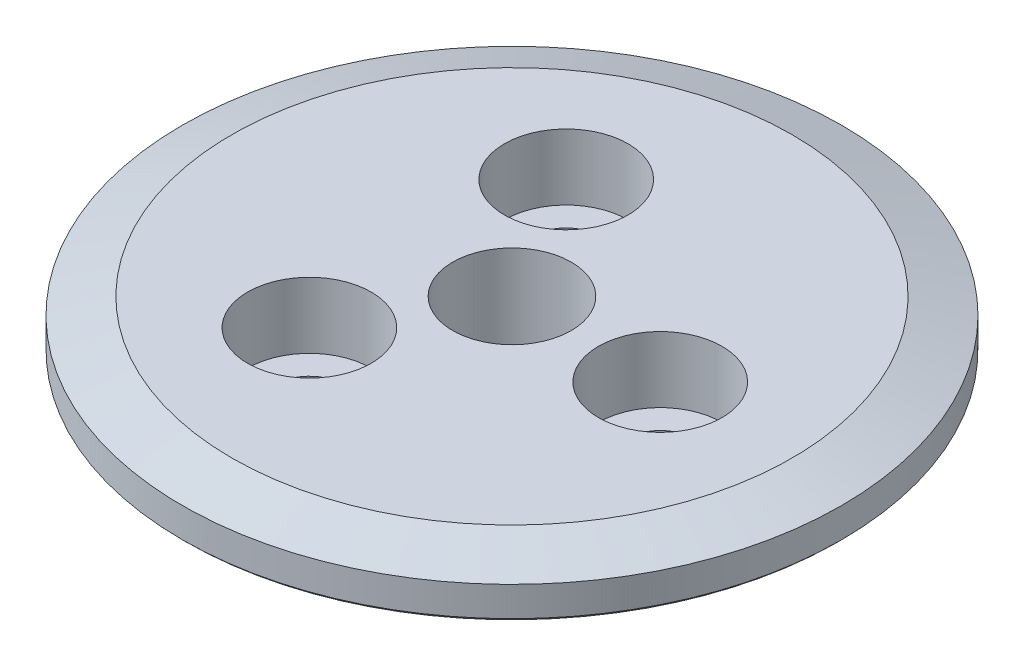
ISO-10303-21;
HEADER;
FILE_DESCRIPTION(('STEP AP214'),'2;1');
FILE_NAME('part.step','',(''),(''),'','','');
FILE_SCHEMA(('AUTOMOTIVE_DESIGN { 1 0 10303 214 1 1 1 1 }'));
ENDSEC;
DATA;
#1=APPLICATION_CONTEXT('core data for automotive mechanical design processes');
#2=APPLICATION_PROTOCOL_DEFINITION('international standard','automotive_design',2000,#1);
#3=PRODUCT_CONTEXT('',#1,'mechanical');
#4=PRODUCT('Part','Part','',(#3));
#5=PRODUCT_RELATED_PRODUCT_CATEGORY('part','',(#4));
#6=PRODUCT_DEFINITION_FORMATION('','',#4);
#7=PRODUCT_DEFINITION_CONTEXT('part definition',#1,'design');
#8=PRODUCT_DEFINITION('design','',#6,#7);
#9=PRODUCT_DEFINITION_SHAPE('','',#8);
#10=(LENGTH_UNIT() NAMED_UNIT(*) SI_UNIT(.MILLI.,.METRE.));
#11=(NAMED_UNIT(*) PLANE_ANGLE_UNIT() SI_UNIT($,.RADIAN.));
#12=(NAMED_UNIT(*) SI_UNIT($,.STERADIAN.) SOLID_ANGLE_UNIT());
#13=UNCERTAINTY_MEASURE_WITH_UNIT(LENGTH_MEASURE(1.E-05),#10,'distance_accuracy_value','');
#14=(GEOMETRIC_REPRESENTATION_CONTEXT(3) GLOBAL_UNCERTAINTY_ASSIGNED_CONTEXT((#13)) GLOBAL_UNIT_ASSIGNED_CONTEXT((#10,
#11,#12)) REPRESENTATION_CONTEXT('',''));
#15=CARTESIAN_POINT('',(0.,0.,0.));
#16=DIRECTION('',(0.,0.,1.));
#17=DIRECTION('',(1.,0.,0.));
#18=AXIS2_PLACEMENT_3D('',#15,#16,#17);
#19=CARTESIAN_POINT('',(0.,-4.6,0.));
#20=DIRECTION('',(0.,-1.,0.));
#21=DIRECTION('',(1.,0.,0.));
#22=AXIS2_PLACEMENT_3D('',#19,#20,#21);
#23=CYLINDRICAL_SURFACE('',#22,14.75);
#24=CARTESIAN_POINT('',(0.,-3.19999999999999,0.));
#25=DIRECTION('',(0.,-1.,0.));
#26=DIRECTION('',(0.,0.,-1.));
#27=AXIS2_PLACEMENT_3D('',#24,#25,#26);
#28=CIRCLE('',#27,14.75);
#29=CARTESIAN_POINT('',(0.,-3.19999999999999,-14.75));
#30=VERTEX_POINT('',#29);
#31=EDGE_CURVE('E168',#30,#30,#28,.T.);
#32=ORIENTED_EDGE('',*,*,#31,.T.);
#33=EDGE_LOOP('',(#32));
#34=FACE_BOUND('',#33,.T.);
#35=CARTESIAN_POINT('',(0.,-5.99999999991025,0.));
#36=DIRECTION('',(0.,1.,0.));
#37=DIRECTION('',(-1.,0.,0.));
#38=AXIS2_PLACEMENT_3D('',#35,#36,#37);
#39=CIRCLE('',#38,14.7499999999103);
#40=CARTESIAN_POINT('',(-14.7499999999103,-5.99999999991025,0.));
#41=VERTEX_POINT('',#40);
#42=EDGE_CURVE('E123',#41,#41,#39,.F.);
#43=ORIENTED_EDGE('',*,*,#42,.F.);
#44=EDGE_LOOP('',(#43));
#45=FACE_BOUND('',#44,.T.);
#46=ADVANCED_FACE('F15',(#34,#45),#23,.T.);
#47=CARTESIAN_POINT('',(0.,-3.19999999999999,0.));
#48=DIRECTION('',(0.,-1.,0.));
#49=DIRECTION('',(0.,0.,-1.));
#50=AXIS2_PLACEMENT_3D('',#47,#48,#49);
#51=TOROIDAL_SURFACE('',#50,14.95,0.2);
#52=ORIENTED_EDGE('',*,*,#31,.F.);
#53=EDGE_LOOP('',(#52));
#54=FACE_BOUND('',#53,.T.);
#55=CARTESIAN_POINT('',(0.,-2.99999999999999,0.));
#56=DIRECTION('',(0.,-1.,0.));
#57=DIRECTION('',(1.,0.,0.));
#58=AXIS2_PLACEMENT_3D('',#55,#56,#57);
#59=CIRCLE('',#58,14.95);
#60=CARTESIAN_POINT('',(14.95,-2.99999999999999,0.));
#61=VERTEX_POINT('',#60);
#62=EDGE_CURVE('E117',#61,#61,#59,.F.);
#63=ORIENTED_EDGE('',*,*,#62,.F.);
#64=EDGE_LOOP('',(#63));
#65=FACE_BOUND('',#64,.T.);
#66=ADVANCED_FACE('F174',(#54,#65),#51,.F.);
#67=CARTESIAN_POINT('',(0.,-5.99999999991025,0.));
#68=DIRECTION('',(0.,1.,0.));
#69=DIRECTION('',(0.,0.,1.));
#70=AXIS2_PLACEMENT_3D('',#67,#68,#69);
#71=CONICAL_SURFACE('',#70,14.7499999999103,0.785398162499996);
#72=CARTESIAN_POINT('',(0.,-6.20000000008974,0.));
#73=DIRECTION('',(0.,1.,0.));
#74=DIRECTION('',(0.,0.,1.));
#75=AXIS2_PLACEMENT_3D('',#72,#73,#74);
#76=CIRCLE('',#75,14.5500000000897);
#77=CARTESIAN_POINT('',(0.,-6.20000000008974,14.5500000000897));
#78=VERTEX_POINT('',#77);
#79=EDGE_CURVE('E18',#78,#78,#76,.F.);
#80=ORIENTED_EDGE('',*,*,#79,.F.);
#81=EDGE_LOOP('',(#80));
#82=FACE_BOUND('',#81,.T.);
#83=ORIENTED_EDGE('',*,*,#42,.T.);
#84=EDGE_LOOP('',(#83));
#85=FACE_BOUND('',#84,.T.);
#86=ADVANCED_FACE('F155',(#82,#85),#71,.T.);
#87=CARTESIAN_POINT('',(0.,-6.4,0.));
#88=DIRECTION('',(0.,-1.,0.));
#89=DIRECTION('',(0.,0.,-1.));
#90=AXIS2_PLACEMENT_3D('',#87,#88,#89);
#91=TOROIDAL_SURFACE('',#90,5.2,0.2);
#92=CARTESIAN_POINT('',(0.,-6.4,0.));
#93=DIRECTION('',(0.,-1.,0.));
#94=DIRECTION('',(1.,0.,0.));
#95=AXIS2_PLACEMENT_3D('',#92,#93,#94);
#96=CIRCLE('',#95,5.);
#97=CARTESIAN_POINT('',(5.,-6.4,0.));
#98=VERTEX_POINT('',#97);
#99=EDGE_CURVE('E112',#98,#98,#96,.T.);
#100=ORIENTED_EDGE('',*,*,#99,.F.);
#101=EDGE_LOOP('',(#100));
#102=FACE_BOUND('',#101,.T.);
#103=CARTESIAN_POINT('',(0.,-6.2,0.));
#104=DIRECTION('',(0.,-1.,0.));
#105=DIRECTION('',(1.,0.,0.));
#106=AXIS2_PLACEMENT_3D('',#103,#104,#105);
#107=CIRCLE('',#106,5.2);
#108=CARTESIAN_POINT('',(5.2,-6.2,0.));
#109=VERTEX_POINT('',#108);
#110=EDGE_CURVE('E97',#109,#109,#107,.F.);
#111=ORIENTED_EDGE('',*,*,#110,.F.);
#112=EDGE_LOOP('',(#111));
#113=FACE_BOUND('',#112,.T.);
#114=ADVANCED_FACE('F151',(#102,#113),#91,.F.);
#115=CARTESIAN_POINT('',(17.375,-3.,0.));
#116=DIRECTION('',(0.,-1.,0.));
#117=DIRECTION('',(0.,0.,-1.));
#118=AXIS2_PLACEMENT_3D('',#115,#116,#117);
#119=PLANE('',#118);
#120=ORIENTED_EDGE('',*,*,#62,.T.);
#121=EDGE_LOOP('',(#120));
#122=FACE_BOUND('',#121,.T.);
#123=CARTESIAN_POINT('',(0.,-3.00000000008974,0.));
#124=DIRECTION('',(0.,1.,0.));
#125=DIRECTION('',(0.,0.,1.));
#126=AXIS2_PLACEMENT_3D('',#123,#124,#125);
#127=CIRCLE('',#126,19.8000000000897);
#128=CARTESIAN_POINT('',(0.,-3.00000000008974,19.8000000000897));
#129=VERTEX_POINT('',#128);
#130=EDGE_CURVE('E94',#129,#129,#127,.T.);
#131=ORIENTED_EDGE('',*,*,#130,.F.);
#132=EDGE_LOOP('',(#131));
#133=FACE_BOUND('',#132,.T.);
#134=ADVANCED_FACE('F140',(#122,#133),#119,.T.);
#135=CARTESIAN_POINT('',(0.,-7.7,0.));
#136=DIRECTION('',(0.,-1.,0.));
#137=DIRECTION('',(1.,0.,0.));
#138=AXIS2_PLACEMENT_3D('',#135,#136,#137);
#139=CYLINDRICAL_SURFACE('',#138,5.);
#140=ORIENTED_EDGE('',*,*,#99,.T.);
#141=EDGE_LOOP('',(#140));
#142=FACE_BOUND('',#141,.T.);
#143=CARTESIAN_POINT('',(0.,-8.99999999990087,0.));
#144=DIRECTION('',(0.,1.,0.));
#145=DIRECTION('',(-1.,0.,0.));
#146=AXIS2_PLACEMENT_3D('',#143,#144,#145);
#147=CIRCLE('',#146,4.99999999988177);
#148=CARTESIAN_POINT('',(-4.99999999988177,-8.99999999990087,0.));
#149=VERTEX_POINT('',#148);
#150=EDGE_CURVE('E93',#149,#149,#147,.F.);
#151=ORIENTED_EDGE('',*,*,#150,.F.);
#152=EDGE_LOOP('',(#151));
#153=FACE_BOUND('',#152,.T.);
#154=ADVANCED_FACE('F150',(#142,#153),#139,.T.);
#155=CARTESIAN_POINT('',(9.875,-6.2,0.));
#156=DIRECTION('',(0.,-1.,0.));
#157=DIRECTION('',(0.,0.,-1.));
#158=AXIS2_PLACEMENT_3D('',#155,#156,#157);
#159=PLANE('',#158);
#160=ORIENTED_EDGE('',*,*,#110,.T.);
#161=EDGE_LOOP('',(#160));
#162=FACE_BOUND('',#161,.T.);
#163=CARTESIAN_POINT('',(9.,-6.19999999999999,0.));
#164=DIRECTION('',(0.,1.,0.));
#165=DIRECTION('',(-1.,0.,0.));
#166=AXIS2_PLACEMENT_3D('',#163,#164,#165);
#167=CIRCLE('',#166,2.05);
#168=CARTESIAN_POINT('',(6.95,-6.19999999999999,0.));
#169=VERTEX_POINT('',#168);
#170=EDGE_CURVE('E90',#169,#169,#167,.T.);
#171=ORIENTED_EDGE('',*,*,#170,.T.);
#172=EDGE_LOOP('',(#171));
#173=FACE_BOUND('',#172,.T.);
#174=CARTESIAN_POINT('',(-4.5,-6.19999999999999,7.79422863405995));
#175=DIRECTION('',(0.,1.,0.));
#176=DIRECTION('',(-1.,0.,0.));
#177=AXIS2_PLACEMENT_3D('',#174,#175,#176);
#178=CIRCLE('',#177,2.05);
#179=CARTESIAN_POINT('',(-6.55,-6.19999999999999,7.79422863405995));
#180=VERTEX_POINT('',#179);
#181=EDGE_CURVE('E86',#180,#180,#178,.T.);
#182=ORIENTED_EDGE('',*,*,#181,.T.);
#183=EDGE_LOOP('',(#182));
#184=FACE_BOUND('',#183,.T.);
#185=CARTESIAN_POINT('',(-4.50000000000001,-6.19999999999999,-7.79422863405995));
#186=DIRECTION('',(0.,1.,0.));
#187=DIRECTION('',(-1.,0.,0.));
#188=AXIS2_PLACEMENT_3D('',#185,#186,#187);
#189=CIRCLE('',#188,2.05);
#190=CARTESIAN_POINT('',(-6.55000000000001,-6.19999999999999,-7.79422863405995));
#191=VERTEX_POINT('',#190);
#192=EDGE_CURVE('E82',#191,#191,#189,.T.);
#193=ORIENTED_EDGE('',*,*,#192,.T.);
#194=EDGE_LOOP('',(#193));
#195=FACE_BOUND('',#194,.T.);
#196=ORIENTED_EDGE('',*,*,#79,.T.);
#197=EDGE_LOOP('',(#196));
#198=FACE_BOUND('',#197,.T.);
#199=ADVANCED_FACE('F253',(#162,#173,#184,#195,#198),#159,.T.);
#200=CARTESIAN_POINT('',(0.,-2.79999999991025,0.));
#201=DIRECTION('',(0.,1.,0.));
#202=DIRECTION('',(0.,0.,1.));
#203=AXIS2_PLACEMENT_3D('',#200,#201,#202);
#204=CONICAL_SURFACE('',#203,19.9999999999103,0.7853981625);
#205=ORIENTED_EDGE('',*,*,#130,.T.);
#206=EDGE_LOOP('',(#205));
#207=FACE_BOUND('',#206,.T.);
#208=CARTESIAN_POINT('',(0.,-2.79999999999999,0.));
#209=DIRECTION('',(0.,-1.,0.));
#210=DIRECTION('',(1.,0.,0.));
#211=AXIS2_PLACEMENT_3D('',#208,#209,#210);
#212=CIRCLE('',#211,20.);
#213=CARTESIAN_POINT('',(20.,-2.79999999999999,0.));
#214=VERTEX_POINT('',#213);
#215=EDGE_CURVE('E81',#214,#214,#212,.F.);
#216=ORIENTED_EDGE('',*,*,#215,.F.);
#217=EDGE_LOOP('',(#216));
#218=FACE_BOUND('',#217,.T.);
#219=ADVANCED_FACE('F250',(#207,#218),#204,.T.);
#220=CARTESIAN_POINT('',(0.,-9.00000000001455,0.));
#221=DIRECTION('',(0.,1.,0.));
#222=DIRECTION('',(0.,0.,1.));
#223=AXIS2_PLACEMENT_3D('',#220,#221,#222);
#224=CONICAL_SURFACE('',#223,4.99999999982492,0.785398162686906);
#225=CARTESIAN_POINT('',(0.,-9.20000000002119,0.));
#226=DIRECTION('',(0.,1.,0.));
#227=DIRECTION('',(0.,0.,1.));
#228=AXIS2_PLACEMENT_3D('',#225,#226,#227);
#229=CIRCLE('',#228,4.8000000001025);
#230=CARTESIAN_POINT('',(0.,-9.20000000002119,4.8000000001025));
#231=VERTEX_POINT('',#230);
#232=EDGE_CURVE('E77',#231,#231,#229,.F.);
#233=ORIENTED_EDGE('',*,*,#232,.F.);
#234=EDGE_LOOP('',(#233));
#235=FACE_BOUND('',#234,.T.);
#236=ORIENTED_EDGE('',*,*,#150,.T.);
#237=EDGE_LOOP('',(#236));
#238=FACE_BOUND('',#237,.T.);
#239=ADVANCED_FACE('F246',(#235,#238),#224,.T.);
#240=CARTESIAN_POINT('',(9.,-57.3117788940459,0.));
#241=DIRECTION('',(0.,1.,0.));
#242=DIRECTION('',(-1.,0.,0.));
#243=AXIS2_PLACEMENT_3D('',#240,#241,#242);
#244=CYLINDRICAL_SURFACE('',#243,2.05);
#245=CARTESIAN_POINT('',(9.,-4.,0.));
#246=DIRECTION('',(0.,1.,0.));
#247=DIRECTION('',(-1.,0.,0.));
#248=AXIS2_PLACEMENT_3D('',#245,#246,#247);
#249=CIRCLE('',#248,2.05);
#250=CARTESIAN_POINT('',(6.95,-4.,0.));
#251=VERTEX_POINT('',#250);
#252=EDGE_CURVE('E73',#251,#251,#249,.F.);
#253=ORIENTED_EDGE('',*,*,#252,.F.);
#254=EDGE_LOOP('',(#253));
#255=FACE_BOUND('',#254,.T.);
#256=ORIENTED_EDGE('',*,*,#170,.F.);
#257=EDGE_LOOP('',(#256));
#258=FACE_BOUND('',#257,.T.);
#259=ADVANCED_FACE('F242',(#255,#258),#244,.F.);
#260=CARTESIAN_POINT('',(-4.49999999999999,-57.3117788940459,7.79422863405995));
#261=DIRECTION('',(0.,1.,0.));
#262=DIRECTION('',(-1.,0.,0.));
#263=AXIS2_PLACEMENT_3D('',#260,#261,#262);
#264=CYLINDRICAL_SURFACE('',#263,2.05);
#265=CARTESIAN_POINT('',(-4.5,-4.,7.79422863405995));
#266=DIRECTION('',(0.,1.,0.));
#267=DIRECTION('',(-1.,0.,0.));
#268=AXIS2_PLACEMENT_3D('',#265,#266,#267);
#269=CIRCLE('',#268,2.05);
#270=CARTESIAN_POINT('',(-6.55,-4.,7.79422863405995));
#271=VERTEX_POINT('',#270);
#272=EDGE_CURVE('E69',#271,#271,#269,.F.);
#273=ORIENTED_EDGE('',*,*,#272,.F.);
#274=EDGE_LOOP('',(#273));
#275=FACE_BOUND('',#274,.T.);
#276=ORIENTED_EDGE('',*,*,#181,.F.);
#277=EDGE_LOOP('',(#276));
#278=FACE_BOUND('',#277,.T.);
#279=ADVANCED_FACE('F238',(#275,#278),#264,.F.);
#280=CARTESIAN_POINT('',(-4.5,-57.3117788940459,-7.79422863405995));
#281=DIRECTION('',(0.,1.,0.));
#282=DIRECTION('',(-1.,0.,0.));
#283=AXIS2_PLACEMENT_3D('',#280,#281,#282);
#284=CYLINDRICAL_SURFACE('',#283,2.05);
#285=CARTESIAN_POINT('',(-4.50000000000001,-4.,-7.79422863405995));
#286=DIRECTION('',(0.,1.,0.));
#287=DIRECTION('',(-1.,0.,0.));
#288=AXIS2_PLACEMENT_3D('',#285,#286,#287);
#289=CIRCLE('',#288,2.05);
#290=CARTESIAN_POINT('',(-6.55000000000001,-4.,-7.79422863405995));
#291=VERTEX_POINT('',#290);
#292=EDGE_CURVE('E66',#291,#291,#289,.F.);
#293=ORIENTED_EDGE('',*,*,#292,.F.);
#294=EDGE_LOOP('',(#293));
#295=FACE_BOUND('',#294,.T.);
#296=ORIENTED_EDGE('',*,*,#192,.F.);
#297=EDGE_LOOP('',(#296));
#298=FACE_BOUND('',#297,.T.);
#299=ADVANCED_FACE('F234',(#295,#298),#284,.F.);
#300=CARTESIAN_POINT('',(0.,-1.5,0.));
#301=DIRECTION('',(0.,-1.,0.));
#302=DIRECTION('',(1.,0.,0.));
#303=AXIS2_PLACEMENT_3D('',#300,#301,#302);
#304=CYLINDRICAL_SURFACE('',#303,20.);
#305=ORIENTED_EDGE('',*,*,#215,.T.);
#306=EDGE_LOOP('',(#305));
#307=FACE_BOUND('',#306,.T.);
#308=CARTESIAN_POINT('',(0.,-1.00000000214087,0.));
#309=DIRECTION('',(0.,-1.,0.));
#310=DIRECTION('',(-1.,0.,0.));
#311=AXIS2_PLACEMENT_3D('',#308,#309,#310);
#312=CIRCLE('',#311,19.9999999992864);
#313=CARTESIAN_POINT('',(-19.9999999992864,-1.00000000214087,0.));
#314=VERTEX_POINT('',#313);
#315=EDGE_CURVE('E65',#314,#314,#312,.F.);
#316=ORIENTED_EDGE('',*,*,#315,.F.);
#317=EDGE_LOOP('',(#316));
#318=FACE_BOUND('',#317,.T.);
#319=ADVANCED_FACE('F230',(#307,#318),#304,.T.);
#320=CARTESIAN_POINT('',(2.5,-9.2,0.));
#321=DIRECTION('',(0.,-1.,0.));
#322=DIRECTION('',(0.,0.,-1.));
#323=AXIS2_PLACEMENT_3D('',#320,#321,#322);
#324=PLANE('',#323);
#325=CARTESIAN_POINT('',(-3.450296E-12,-9.2,1.865175E-13));
#326=DIRECTION('',(0.,-1.,0.));
#327=DIRECTION('',(0.,0.,-1.));
#328=AXIS2_PLACEMENT_3D('',#325,#326,#327);
#329=CIRCLE('',#328,3.6);
#330=CARTESIAN_POINT('',(-3.450296E-12,-9.2,-3.59999999999981));
#331=VERTEX_POINT('',#330);
#332=EDGE_CURVE('E61',#331,#331,#329,.F.);
#333=ORIENTED_EDGE('',*,*,#332,.T.);
#334=EDGE_LOOP('',(#333));
#335=FACE_BOUND('',#334,.T.);
#336=ORIENTED_EDGE('',*,*,#232,.T.);
#337=EDGE_LOOP('',(#336));
#338=FACE_BOUND('',#337,.T.);
#339=ADVANCED_FACE('F226',(#335,#338),#324,.T.);
#340=CARTESIAN_POINT('',(9.,-4.,0.));
#341=DIRECTION('',(0.,1.,0.));
#342=DIRECTION('',(0.,0.,1.));
#343=AXIS2_PLACEMENT_3D('',#340,#341,#342);
#344=PLANE('',#343);
#345=ORIENTED_EDGE('',*,*,#252,.T.);
#346=EDGE_LOOP('',(#345));
#347=FACE_BOUND('',#346,.T.);
#348=CARTESIAN_POINT('',(9.,-4.,0.));
#349=DIRECTION('',(0.,1.,0.));
#350=DIRECTION('',(-1.,0.,0.));
#351=AXIS2_PLACEMENT_3D('',#348,#349,#350);
#352=CIRCLE('',#351,3.75);
#353=CARTESIAN_POINT('',(5.25,-4.,0.));
#354=VERTEX_POINT('',#353);
#355=EDGE_CURVE('E57',#354,#354,#352,.T.);
#356=ORIENTED_EDGE('',*,*,#355,.T.);
#357=EDGE_LOOP('',(#356));
#358=FACE_BOUND('',#357,.T.);
#359=ADVANCED_FACE('F222',(#347,#358),#344,.T.);
#360=CARTESIAN_POINT('',(-4.5,-4.,7.79422863405995));
#361=DIRECTION('',(0.,1.,0.));
#362=DIRECTION('',(0.,0.,1.));
#363=AXIS2_PLACEMENT_3D('',#360,#361,#362);
#364=PLANE('',#363);
#365=ORIENTED_EDGE('',*,*,#272,.T.);
#366=EDGE_LOOP('',(#365));
#367=FACE_BOUND('',#366,.T.);
#368=CARTESIAN_POINT('',(-4.5,-4.,7.79422863405995));
#369=DIRECTION('',(0.,1.,0.));
#370=DIRECTION('',(-1.,0.,0.));
#371=AXIS2_PLACEMENT_3D('',#368,#369,#370);
#372=CIRCLE('',#371,3.75);
#373=CARTESIAN_POINT('',(-8.25,-4.,7.79422863405995));
#374=VERTEX_POINT('',#373);
#375=EDGE_CURVE('E53',#374,#374,#372,.T.);
#376=ORIENTED_EDGE('',*,*,#375,.T.);
#377=EDGE_LOOP('',(#376));
#378=FACE_BOUND('',#377,.T.);
#379=ADVANCED_FACE('F218',(#367,#378),#364,.T.);
#380=CARTESIAN_POINT('',(-4.5,-4.,-7.79422863405995));
#381=DIRECTION('',(0.,1.,0.));
#382=DIRECTION('',(0.,0.,1.));
#383=AXIS2_PLACEMENT_3D('',#380,#381,#382);
#384=PLANE('',#383);
#385=ORIENTED_EDGE('',*,*,#292,.T.);
#386=EDGE_LOOP('',(#385));
#387=FACE_BOUND('',#386,.T.);
#388=CARTESIAN_POINT('',(-4.5,-4.,-7.79422863405995));
#389=DIRECTION('',(0.,1.,0.));
#390=DIRECTION('',(-1.,0.,0.));
#391=AXIS2_PLACEMENT_3D('',#388,#389,#390);
#392=CIRCLE('',#391,3.75);
#393=CARTESIAN_POINT('',(-8.25,-4.,-7.79422863405995));
#394=VERTEX_POINT('',#393);
#395=EDGE_CURVE('E49',#394,#394,#392,.T.);
#396=ORIENTED_EDGE('',*,*,#395,.T.);
#397=EDGE_LOOP('',(#396));
#398=FACE_BOUND('',#397,.T.);
#399=ADVANCED_FACE('F214',(#387,#398),#384,.T.);
#400=CARTESIAN_POINT('',(0.,-1.00000000214087,0.));
#401=DIRECTION('',(0.,-1.,0.));
#402=DIRECTION('',(0.,0.,-1.));
#403=AXIS2_PLACEMENT_3D('',#400,#401,#402);
#404=CONICAL_SURFACE('',#403,19.9999999992864,1.24904577097101);
#405=ORIENTED_EDGE('',*,*,#315,.T.);
#406=EDGE_LOOP('',(#405));
#407=FACE_BOUND('',#406,.T.);
#408=CARTESIAN_POINT('',(0.,2.14086560978988E-09,0.));
#409=DIRECTION('',(0.,-1.,0.));
#410=DIRECTION('',(0.,0.,-1.));
#411=AXIS2_PLACEMENT_3D('',#408,#409,#410);
#412=CIRCLE('',#411,17.0000000007136);
#413=CARTESIAN_POINT('',(0.,2.14086560978988E-09,-17.0000000007136));
#414=VERTEX_POINT('',#413);
#415=EDGE_CURVE('E45',#414,#414,#412,.F.);
#416=ORIENTED_EDGE('',*,*,#415,.F.);
#417=EDGE_LOOP('',(#416));
#418=FACE_BOUND('',#417,.T.);
#419=ADVANCED_FACE('F210',(#407,#418),#404,.T.);
#420=CARTESIAN_POINT('',(-3.450296E-12,0.,1.865175E-13));
#421=DIRECTION('',(0.,-1.,0.));
#422=DIRECTION('',(0.,0.,-1.));
#423=AXIS2_PLACEMENT_3D('',#420,#421,#422);
#424=CYLINDRICAL_SURFACE('',#423,3.6);
#425=CARTESIAN_POINT('',(-3.450296E-12,0.,1.865175E-13));
#426=DIRECTION('',(0.,-1.,0.));
#427=DIRECTION('',(0.,0.,-1.));
#428=AXIS2_PLACEMENT_3D('',#425,#426,#427);
#429=CIRCLE('',#428,3.6);
#430=CARTESIAN_POINT('',(-3.450296E-12,0.,-3.59999999999981));
#431=VERTEX_POINT('',#430);
#432=EDGE_CURVE('E41',#431,#431,#429,.T.);
#433=ORIENTED_EDGE('',*,*,#432,.F.);
#434=EDGE_LOOP('',(#433));
#435=FACE_BOUND('',#434,.T.);
#436=ORIENTED_EDGE('',*,*,#332,.F.);
#437=EDGE_LOOP('',(#436));
#438=FACE_BOUND('',#437,.T.);
#439=ADVANCED_FACE('F206',(#435,#438),#424,.F.);
#440=CARTESIAN_POINT('',(9.,-2.,0.));
#441=DIRECTION('',(0.,1.,0.));
#442=DIRECTION('',(-1.,0.,0.));
#443=AXIS2_PLACEMENT_3D('',#440,#441,#442);
#444=CYLINDRICAL_SURFACE('',#443,3.75);
#445=ORIENTED_EDGE('',*,*,#355,.F.);
#446=EDGE_LOOP('',(#445));
#447=FACE_BOUND('',#446,.T.);
#448=CARTESIAN_POINT('',(9.,0.,0.));
#449=DIRECTION('',(0.,1.,0.));
#450=DIRECTION('',(-1.,0.,0.));
#451=AXIS2_PLACEMENT_3D('',#448,#449,#450);
#452=CIRCLE('',#451,3.75);
#453=CARTESIAN_POINT('',(5.25,0.,0.));
#454=VERTEX_POINT('',#453);
#455=EDGE_CURVE('E32',#454,#454,#452,.F.);
#456=ORIENTED_EDGE('',*,*,#455,.F.);
#457=EDGE_LOOP('',(#456));
#458=FACE_BOUND('',#457,.T.);
#459=ADVANCED_FACE('F202',(#447,#458),#444,.F.);
#460=CARTESIAN_POINT('',(-4.5,-2.,7.79422863405995));
#461=DIRECTION('',(0.,1.,0.));
#462=DIRECTION('',(-1.,0.,0.));
#463=AXIS2_PLACEMENT_3D('',#460,#461,#462);
#464=CYLINDRICAL_SURFACE('',#463,3.75);
#465=ORIENTED_EDGE('',*,*,#375,.F.);
#466=EDGE_LOOP('',(#465));
#467=FACE_BOUND('',#466,.T.);
#468=CARTESIAN_POINT('',(-4.5,0.,7.79422863405995));
#469=DIRECTION('',(0.,1.,0.));
#470=DIRECTION('',(-1.,0.,0.));
#471=AXIS2_PLACEMENT_3D('',#468,#469,#470);
#472=CIRCLE('',#471,3.75);
#473=CARTESIAN_POINT('',(-8.25,0.,7.79422863405995));
#474=VERTEX_POINT('',#473);
#475=EDGE_CURVE('E23',#474,#474,#472,.F.);
#476=ORIENTED_EDGE('',*,*,#475,.F.);
#477=EDGE_LOOP('',(#476));
#478=FACE_BOUND('',#477,.T.);
#479=ADVANCED_FACE('F195',(#467,#478),#464,.F.);
#480=CARTESIAN_POINT('',(-4.5,-2.,-7.79422863405995));
#481=DIRECTION('',(0.,1.,0.));
#482=DIRECTION('',(-1.,0.,0.));
#483=AXIS2_PLACEMENT_3D('',#480,#481,#482);
#484=CYLINDRICAL_SURFACE('',#483,3.75);
#485=ORIENTED_EDGE('',*,*,#395,.F.);
#486=EDGE_LOOP('',(#485));
#487=FACE_BOUND('',#486,.T.);
#488=CARTESIAN_POINT('',(-4.5,0.,-7.79422863405995));
#489=DIRECTION('',(0.,1.,0.));
#490=DIRECTION('',(-1.,0.,0.));
#491=AXIS2_PLACEMENT_3D('',#488,#489,#490);
#492=CIRCLE('',#491,3.75);
#493=CARTESIAN_POINT('',(-8.25,0.,-7.79422863405995));
#494=VERTEX_POINT('',#493);
#495=EDGE_CURVE('E10',#494,#494,#492,.F.);
#496=ORIENTED_EDGE('',*,*,#495,.F.);
#497=EDGE_LOOP('',(#496));
#498=FACE_BOUND('',#497,.T.);
#499=ADVANCED_FACE('F190',(#487,#498),#484,.F.);
#500=CARTESIAN_POINT('',(10.,0.,0.));
#501=DIRECTION('',(0.,1.,0.));
#502=DIRECTION('',(0.,0.,1.));
#503=AXIS2_PLACEMENT_3D('',#500,#501,#502);
#504=PLANE('',#503);
#505=ORIENTED_EDGE('',*,*,#495,.T.);
#506=EDGE_LOOP('',(#505));
#507=FACE_BOUND('',#506,.T.);
#508=ORIENTED_EDGE('',*,*,#475,.T.);
#509=EDGE_LOOP('',(#508));
#510=FACE_BOUND('',#509,.T.);
#511=ORIENTED_EDGE('',*,*,#455,.T.);
#512=EDGE_LOOP('',(#511));
#513=FACE_BOUND('',#512,.T.);
#514=ORIENTED_EDGE('',*,*,#432,.T.);
#515=EDGE_LOOP('',(#514));
#516=FACE_BOUND('',#515,.T.);
#517=ORIENTED_EDGE('',*,*,#415,.T.);
#518=EDGE_LOOP('',(#517));
#519=FACE_BOUND('',#518,.T.);
#520=ADVANCED_FACE('F188',(#507,#510,#513,#516,#519),#504,.T.);
#521=CLOSED_SHELL('',(#46,#66,#86,#114,#134,#154,#199,#219,#239,#259,#279,#299,#319,#339,#359,
#379,#399,#419,#439,#459,#479,#499,#520));
#522=MANIFOLD_SOLID_BREP('B1',#521);
#523=ADVANCED_BREP_SHAPE_REPRESENTATION('',(#18,#522),#14);
#524=SHAPE_DEFINITION_REPRESENTATION(#9,#523);
ENDSEC;
END-ISO-10303-21;
